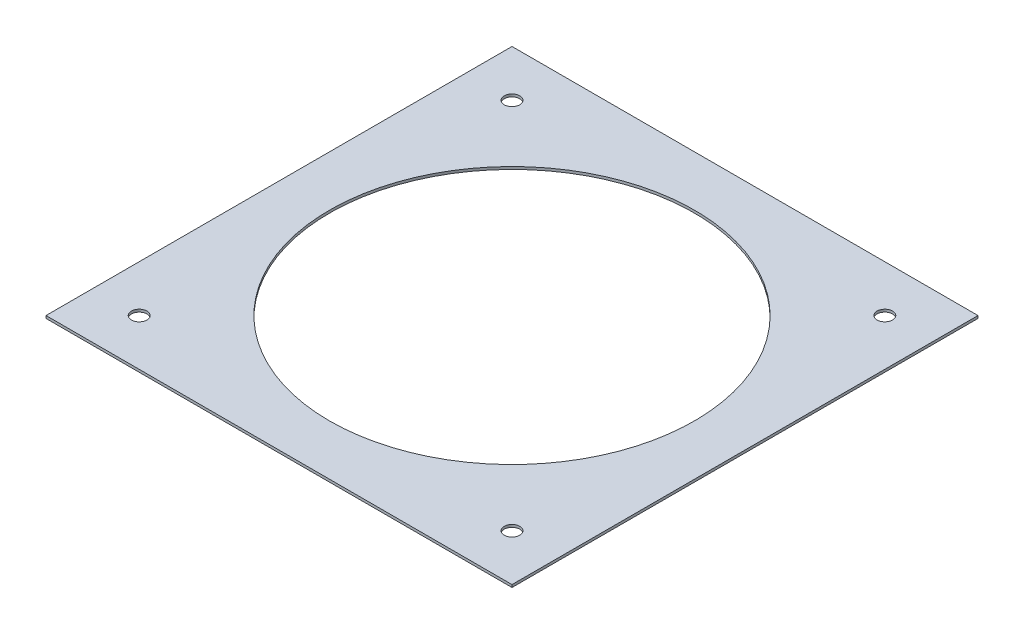
ISO-10303-21;
HEADER;
FILE_DESCRIPTION(('STEP AP214'),'2;1');
FILE_NAME('part.step','',(''),(''),'','','');
FILE_SCHEMA(('AUTOMOTIVE_DESIGN { 1 0 10303 214 1 1 1 1 }'));
ENDSEC;
DATA;
#1=APPLICATION_CONTEXT('core data for automotive mechanical design processes');
#2=APPLICATION_PROTOCOL_DEFINITION('international standard','automotive_design',2000,#1);
#3=PRODUCT_CONTEXT('',#1,'mechanical');
#4=PRODUCT('Part','Part','',(#3));
#5=PRODUCT_RELATED_PRODUCT_CATEGORY('part','',(#4));
#6=PRODUCT_DEFINITION_FORMATION('','',#4);
#7=PRODUCT_DEFINITION_CONTEXT('part definition',#1,'design');
#8=PRODUCT_DEFINITION('design','',#6,#7);
#9=PRODUCT_DEFINITION_SHAPE('','',#8);
#10=(LENGTH_UNIT() NAMED_UNIT(*) SI_UNIT(.MILLI.,.METRE.));
#11=(NAMED_UNIT(*) PLANE_ANGLE_UNIT() SI_UNIT($,.RADIAN.));
#12=(NAMED_UNIT(*) SI_UNIT($,.STERADIAN.) SOLID_ANGLE_UNIT());
#13=UNCERTAINTY_MEASURE_WITH_UNIT(LENGTH_MEASURE(1.E-05),#10,'distance_accuracy_value','');
#14=(GEOMETRIC_REPRESENTATION_CONTEXT(3) GLOBAL_UNCERTAINTY_ASSIGNED_CONTEXT((#13)) GLOBAL_UNIT_ASSIGNED_CONTEXT((#10,
#11,#12)) REPRESENTATION_CONTEXT('',''));
#15=CARTESIAN_POINT('',(0.,0.,0.));
#16=DIRECTION('',(0.,0.,1.));
#17=DIRECTION('',(1.,0.,0.));
#18=AXIS2_PLACEMENT_3D('',#15,#16,#17);
#19=CARTESIAN_POINT('',(0.,0.4191,0.));
#20=DIRECTION('',(0.,-1.,0.));
#21=DIRECTION('',(0.,0.,-1.));
#22=AXIS2_PLACEMENT_3D('',#19,#20,#21);
#23=PLANE('',#22);
#24=CARTESIAN_POINT('',(-60.9599999999998,0.4191,60.9600000000002));
#25=DIRECTION('',(0.,1.,0.));
#26=DIRECTION('',(1.,0.,0.));
#27=AXIS2_PLACEMENT_3D('',#24,#25,#26);
#28=CIRCLE('',#27,2.54);
#29=CARTESIAN_POINT('',(-58.4199999999998,0.4191,60.9600000000002));
#30=VERTEX_POINT('',#29);
#31=EDGE_CURVE('E162',#30,#30,#28,.T.);
#32=ORIENTED_EDGE('',*,*,#31,.F.);
#33=EDGE_LOOP('',(#32));
#34=FACE_BOUND('',#33,.T.);
#35=CARTESIAN_POINT('',(60.96,0.4191,60.96));
#36=DIRECTION('',(0.,1.,0.));
#37=DIRECTION('',(0.,0.,-1.));
#38=AXIS2_PLACEMENT_3D('',#35,#36,#37);
#39=CIRCLE('',#38,2.54);
#40=CARTESIAN_POINT('',(60.96,0.4191,58.42));
#41=VERTEX_POINT('',#40);
#42=EDGE_CURVE('E154',#41,#41,#39,.T.);
#43=ORIENTED_EDGE('',*,*,#42,.F.);
#44=EDGE_LOOP('',(#43));
#45=FACE_BOUND('',#44,.T.);
#46=CARTESIAN_POINT('',(60.9599999999994,0.4191,-60.9600000000006));
#47=DIRECTION('',(0.,1.,0.));
#48=DIRECTION('',(-1.,0.,0.));
#49=AXIS2_PLACEMENT_3D('',#46,#47,#48);
#50=CIRCLE('',#49,2.54);
#51=CARTESIAN_POINT('',(58.4199999999994,0.4191,-60.9600000000006));
#52=VERTEX_POINT('',#51);
#53=EDGE_CURVE('E146',#52,#52,#50,.T.);
#54=ORIENTED_EDGE('',*,*,#53,.F.);
#55=EDGE_LOOP('',(#54));
#56=FACE_BOUND('',#55,.T.);
#57=CARTESIAN_POINT('',(-60.96,0.4191,-60.96));
#58=DIRECTION('',(0.,1.,0.));
#59=DIRECTION('',(0.,0.,1.));
#60=AXIS2_PLACEMENT_3D('',#57,#58,#59);
#61=CIRCLE('',#60,2.54);
#62=CARTESIAN_POINT('',(-60.96,0.4191,-58.42));
#63=VERTEX_POINT('',#62);
#64=EDGE_CURVE('E138',#63,#63,#61,.T.);
#65=ORIENTED_EDGE('',*,*,#64,.F.);
#66=EDGE_LOOP('',(#65));
#67=FACE_BOUND('',#66,.T.);
#68=DIRECTION('',(0.,0.,-1.));
#69=VECTOR('',#68,1.);
#70=CARTESIAN_POINT('',(76.2,0.4191,76.2));
#71=LINE('',#70,#69);
#72=CARTESIAN_POINT('',(76.2,0.4191,76.2));
#73=VERTEX_POINT('',#72);
#74=CARTESIAN_POINT('',(76.2,0.4191,-76.2));
#75=VERTEX_POINT('',#74);
#76=EDGE_CURVE('E92',#73,#75,#71,.T.);
#77=ORIENTED_EDGE('',*,*,#76,.T.);
#78=DIRECTION('',(-1.,0.,0.));
#79=VECTOR('',#78,1.);
#80=CARTESIAN_POINT('',(-76.2,0.4191,-76.2));
#81=LINE('',#80,#79);
#82=CARTESIAN_POINT('',(-76.2,0.4191,-76.2));
#83=VERTEX_POINT('',#82);
#84=EDGE_CURVE('E87',#75,#83,#81,.T.);
#85=ORIENTED_EDGE('',*,*,#84,.T.);
#86=DIRECTION('',(0.,0.,1.));
#87=VECTOR('',#86,1.);
#88=CARTESIAN_POINT('',(-76.2,0.4191,76.2));
#89=LINE('',#88,#87);
#90=CARTESIAN_POINT('',(-76.2,0.4191,76.2));
#91=VERTEX_POINT('',#90);
#92=EDGE_CURVE('E90',#83,#91,#89,.T.);
#93=ORIENTED_EDGE('',*,*,#92,.T.);
#94=DIRECTION('',(1.,0.,0.));
#95=VECTOR('',#94,1.);
#96=CARTESIAN_POINT('',(-76.2,0.4191,76.2));
#97=LINE('',#96,#95);
#98=EDGE_CURVE('E57',#91,#73,#97,.T.);
#99=ORIENTED_EDGE('',*,*,#98,.T.);
#100=EDGE_LOOP('',(#77,#85,#93,#99));
#101=FACE_BOUND('',#100,.T.);
#102=CARTESIAN_POINT('',(0.,0.4191,0.));
#103=DIRECTION('',(0.,1.,0.));
#104=DIRECTION('',(0.,0.,1.));
#105=AXIS2_PLACEMENT_3D('',#102,#103,#104);
#106=CIRCLE('',#105,59.69);
#107=CARTESIAN_POINT('',(0.,0.4191,59.69));
#108=VERTEX_POINT('',#107);
#109=EDGE_CURVE('E112',#108,#108,#106,.T.);
#110=ORIENTED_EDGE('',*,*,#109,.F.);
#111=EDGE_LOOP('',(#110));
#112=FACE_BOUND('',#111,.T.);
#113=ADVANCED_FACE('F39',(#34,#45,#56,#67,#101,#112),#23,.F.);
#114=CARTESIAN_POINT('',(0.,-0.4191,0.));
#115=DIRECTION('',(0.,-1.,0.));
#116=DIRECTION('',(0.,0.,-1.));
#117=AXIS2_PLACEMENT_3D('',#114,#115,#116);
#118=PLANE('',#117);
#119=CARTESIAN_POINT('',(-60.9599999999998,-0.4191,60.9600000000002));
#120=DIRECTION('',(0.,1.,0.));
#121=DIRECTION('',(1.,0.,0.));
#122=AXIS2_PLACEMENT_3D('',#119,#120,#121);
#123=CIRCLE('',#122,2.54);
#124=CARTESIAN_POINT('',(-58.4199999999998,-0.4191,60.9600000000002));
#125=VERTEX_POINT('',#124);
#126=EDGE_CURVE('E142',#125,#125,#123,.T.);
#127=ORIENTED_EDGE('',*,*,#126,.T.);
#128=EDGE_LOOP('',(#127));
#129=FACE_BOUND('',#128,.T.);
#130=CARTESIAN_POINT('',(60.96,-0.4191,60.96));
#131=DIRECTION('',(0.,1.,0.));
#132=DIRECTION('',(0.,0.,-1.));
#133=AXIS2_PLACEMENT_3D('',#130,#131,#132);
#134=CIRCLE('',#133,2.54);
#135=CARTESIAN_POINT('',(60.96,-0.4191,58.42));
#136=VERTEX_POINT('',#135);
#137=EDGE_CURVE('E158',#136,#136,#134,.T.);
#138=ORIENTED_EDGE('',*,*,#137,.T.);
#139=EDGE_LOOP('',(#138));
#140=FACE_BOUND('',#139,.T.);
#141=CARTESIAN_POINT('',(60.9599999999994,-0.4191,-60.9600000000006));
#142=DIRECTION('',(0.,1.,0.));
#143=DIRECTION('',(-1.,0.,0.));
#144=AXIS2_PLACEMENT_3D('',#141,#142,#143);
#145=CIRCLE('',#144,2.54);
#146=CARTESIAN_POINT('',(58.4199999999994,-0.4191,-60.9600000000006));
#147=VERTEX_POINT('',#146);
#148=EDGE_CURVE('E150',#147,#147,#145,.T.);
#149=ORIENTED_EDGE('',*,*,#148,.T.);
#150=EDGE_LOOP('',(#149));
#151=FACE_BOUND('',#150,.T.);
#152=CARTESIAN_POINT('',(-60.96,-0.4191,-60.96));
#153=DIRECTION('',(0.,1.,0.));
#154=DIRECTION('',(0.,0.,1.));
#155=AXIS2_PLACEMENT_3D('',#152,#153,#154);
#156=CIRCLE('',#155,2.54);
#157=CARTESIAN_POINT('',(-60.96,-0.4191,-58.42));
#158=VERTEX_POINT('',#157);
#159=EDGE_CURVE('E134',#158,#158,#156,.T.);
#160=ORIENTED_EDGE('',*,*,#159,.T.);
#161=EDGE_LOOP('',(#160));
#162=FACE_BOUND('',#161,.T.);
#163=DIRECTION('',(0.,0.,-1.));
#164=VECTOR('',#163,1.);
#165=CARTESIAN_POINT('',(76.2,-0.4191,76.2));
#166=LINE('',#165,#164);
#167=CARTESIAN_POINT('',(76.2,-0.4191,76.2));
#168=VERTEX_POINT('',#167);
#169=CARTESIAN_POINT('',(76.2,-0.4191,-76.2));
#170=VERTEX_POINT('',#169);
#171=EDGE_CURVE('E108',#168,#170,#166,.T.);
#172=ORIENTED_EDGE('',*,*,#171,.F.);
#173=DIRECTION('',(1.,0.,0.));
#174=VECTOR('',#173,1.);
#175=CARTESIAN_POINT('',(-76.2,-0.4191,76.2));
#176=LINE('',#175,#174);
#177=CARTESIAN_POINT('',(-76.2,-0.4191,76.2));
#178=VERTEX_POINT('',#177);
#179=EDGE_CURVE('E80',#178,#168,#176,.T.);
#180=ORIENTED_EDGE('',*,*,#179,.F.);
#181=DIRECTION('',(0.,0.,1.));
#182=VECTOR('',#181,1.);
#183=CARTESIAN_POINT('',(-76.2,-0.4191,76.2));
#184=LINE('',#183,#182);
#185=CARTESIAN_POINT('',(-76.2,-0.4191,-76.2));
#186=VERTEX_POINT('',#185);
#187=EDGE_CURVE('E74',#186,#178,#184,.T.);
#188=ORIENTED_EDGE('',*,*,#187,.F.);
#189=DIRECTION('',(-1.,0.,0.));
#190=VECTOR('',#189,1.);
#191=CARTESIAN_POINT('',(-76.2,-0.4191,-76.2));
#192=LINE('',#191,#190);
#193=EDGE_CURVE('E97',#170,#186,#192,.T.);
#194=ORIENTED_EDGE('',*,*,#193,.F.);
#195=EDGE_LOOP('',(#172,#180,#188,#194));
#196=FACE_BOUND('',#195,.T.);
#197=CARTESIAN_POINT('',(0.,-0.4191,0.));
#198=DIRECTION('',(0.,1.,0.));
#199=DIRECTION('',(0.,0.,1.));
#200=AXIS2_PLACEMENT_3D('',#197,#198,#199);
#201=CIRCLE('',#200,59.69);
#202=CARTESIAN_POINT('',(0.,-0.4191,59.69));
#203=VERTEX_POINT('',#202);
#204=EDGE_CURVE('E130',#203,#203,#201,.T.);
#205=ORIENTED_EDGE('',*,*,#204,.T.);
#206=EDGE_LOOP('',(#205));
#207=FACE_BOUND('',#206,.T.);
#208=ADVANCED_FACE('F125',(#129,#140,#151,#162,#196,#207),#118,.T.);
#209=CARTESIAN_POINT('',(76.2,0.4191,76.2));
#210=DIRECTION('',(-1.,0.,0.));
#211=DIRECTION('',(0.,0.,1.));
#212=AXIS2_PLACEMENT_3D('',#209,#210,#211);
#213=PLANE('',#212);
#214=ORIENTED_EDGE('',*,*,#171,.T.);
#215=DIRECTION('',(0.,-1.,0.));
#216=VECTOR('',#215,1.);
#217=CARTESIAN_POINT('',(76.2,0.4191,-76.2));
#218=LINE('',#217,#216);
#219=EDGE_CURVE('E11',#75,#170,#218,.T.);
#220=ORIENTED_EDGE('',*,*,#219,.F.);
#221=ORIENTED_EDGE('',*,*,#76,.F.);
#222=DIRECTION('',(0.,-1.,0.));
#223=VECTOR('',#222,1.);
#224=CARTESIAN_POINT('',(76.2,0.4191,76.2));
#225=LINE('',#224,#223);
#226=EDGE_CURVE('E104',#73,#168,#225,.T.);
#227=ORIENTED_EDGE('',*,*,#226,.T.);
#228=EDGE_LOOP('',(#214,#220,#221,#227));
#229=FACE_BOUND('',#228,.T.);
#230=ADVANCED_FACE('F41',(#229),#213,.F.);
#231=CARTESIAN_POINT('',(-76.2,0.4191,-76.2));
#232=DIRECTION('',(0.,0.,1.));
#233=DIRECTION('',(1.,0.,0.));
#234=AXIS2_PLACEMENT_3D('',#231,#232,#233);
#235=PLANE('',#234);
#236=ORIENTED_EDGE('',*,*,#193,.T.);
#237=DIRECTION('',(0.,-1.,0.));
#238=VECTOR('',#237,1.);
#239=CARTESIAN_POINT('',(-76.2,0.4191,-76.2));
#240=LINE('',#239,#238);
#241=EDGE_CURVE('E49',#83,#186,#240,.T.);
#242=ORIENTED_EDGE('',*,*,#241,.F.);
#243=ORIENTED_EDGE('',*,*,#84,.F.);
#244=ORIENTED_EDGE('',*,*,#219,.T.);
#245=EDGE_LOOP('',(#236,#242,#243,#244));
#246=FACE_BOUND('',#245,.T.);
#247=ADVANCED_FACE('F96',(#246),#235,.F.);
#248=CARTESIAN_POINT('',(-76.2,0.4191,76.2));
#249=DIRECTION('',(1.,0.,0.));
#250=DIRECTION('',(0.,0.,-1.));
#251=AXIS2_PLACEMENT_3D('',#248,#249,#250);
#252=PLANE('',#251);
#253=ORIENTED_EDGE('',*,*,#187,.T.);
#254=DIRECTION('',(0.,-1.,0.));
#255=VECTOR('',#254,1.);
#256=CARTESIAN_POINT('',(-76.2,0.4191,76.2));
#257=LINE('',#256,#255);
#258=EDGE_CURVE('E99',#91,#178,#257,.T.);
#259=ORIENTED_EDGE('',*,*,#258,.F.);
#260=ORIENTED_EDGE('',*,*,#92,.F.);
#261=ORIENTED_EDGE('',*,*,#241,.T.);
#262=EDGE_LOOP('',(#253,#259,#260,#261));
#263=FACE_BOUND('',#262,.T.);
#264=ADVANCED_FACE('F100',(#263),#252,.F.);
#265=CARTESIAN_POINT('',(-76.2,0.4191,76.2));
#266=DIRECTION('',(0.,0.,-1.));
#267=DIRECTION('',(-1.,0.,0.));
#268=AXIS2_PLACEMENT_3D('',#265,#266,#267);
#269=PLANE('',#268);
#270=ORIENTED_EDGE('',*,*,#179,.T.);
#271=ORIENTED_EDGE('',*,*,#226,.F.);
#272=ORIENTED_EDGE('',*,*,#98,.F.);
#273=ORIENTED_EDGE('',*,*,#258,.T.);
#274=EDGE_LOOP('',(#270,#271,#272,#273));
#275=FACE_BOUND('',#274,.T.);
#276=ADVANCED_FACE('F122',(#275),#269,.F.);
#277=CARTESIAN_POINT('',(0.,0.4191,0.));
#278=DIRECTION('',(0.,-1.,0.));
#279=DIRECTION('',(0.,0.,-1.));
#280=AXIS2_PLACEMENT_3D('',#277,#278,#279);
#281=CYLINDRICAL_SURFACE('',#280,59.69);
#282=ORIENTED_EDGE('',*,*,#109,.T.);
#283=EDGE_LOOP('',(#282));
#284=FACE_BOUND('',#283,.T.);
#285=ORIENTED_EDGE('',*,*,#204,.F.);
#286=EDGE_LOOP('',(#285));
#287=FACE_BOUND('',#286,.T.);
#288=ADVANCED_FACE('F191',(#284,#287),#281,.F.);
#289=CARTESIAN_POINT('',(-60.96,-0.4191,-60.96));
#290=DIRECTION('',(0.,1.,0.));
#291=DIRECTION('',(0.,0.,1.));
#292=AXIS2_PLACEMENT_3D('',#289,#290,#291);
#293=CYLINDRICAL_SURFACE('',#292,2.54);
#294=ORIENTED_EDGE('',*,*,#159,.F.);
#295=EDGE_LOOP('',(#294));
#296=FACE_BOUND('',#295,.T.);
#297=ORIENTED_EDGE('',*,*,#64,.T.);
#298=EDGE_LOOP('',(#297));
#299=FACE_BOUND('',#298,.T.);
#300=ADVANCED_FACE('F188',(#296,#299),#293,.F.);
#301=CARTESIAN_POINT('',(60.9599999999994,-0.4191,-60.9600000000006));
#302=DIRECTION('',(0.,1.,0.));
#303=DIRECTION('',(0.,0.,1.));
#304=AXIS2_PLACEMENT_3D('',#301,#302,#303);
#305=CYLINDRICAL_SURFACE('',#304,2.54);
#306=ORIENTED_EDGE('',*,*,#148,.F.);
#307=EDGE_LOOP('',(#306));
#308=FACE_BOUND('',#307,.T.);
#309=ORIENTED_EDGE('',*,*,#53,.T.);
#310=EDGE_LOOP('',(#309));
#311=FACE_BOUND('',#310,.T.);
#312=ADVANCED_FACE('F190',(#308,#311),#305,.F.);
#313=CARTESIAN_POINT('',(60.96,-0.4191,60.96));
#314=DIRECTION('',(0.,1.,0.));
#315=DIRECTION('',(0.,0.,1.));
#316=AXIS2_PLACEMENT_3D('',#313,#314,#315);
#317=CYLINDRICAL_SURFACE('',#316,2.54);
#318=ORIENTED_EDGE('',*,*,#137,.F.);
#319=EDGE_LOOP('',(#318));
#320=FACE_BOUND('',#319,.T.);
#321=ORIENTED_EDGE('',*,*,#42,.T.);
#322=EDGE_LOOP('',(#321));
#323=FACE_BOUND('',#322,.T.);
#324=ADVANCED_FACE('F175',(#320,#323),#317,.F.);
#325=CARTESIAN_POINT('',(-60.9599999999998,-0.4191,60.9600000000002));
#326=DIRECTION('',(0.,1.,0.));
#327=DIRECTION('',(0.,0.,1.));
#328=AXIS2_PLACEMENT_3D('',#325,#326,#327);
#329=CYLINDRICAL_SURFACE('',#328,2.54);
#330=ORIENTED_EDGE('',*,*,#126,.F.);
#331=EDGE_LOOP('',(#330));
#332=FACE_BOUND('',#331,.T.);
#333=ORIENTED_EDGE('',*,*,#31,.T.);
#334=EDGE_LOOP('',(#333));
#335=FACE_BOUND('',#334,.T.);
#336=ADVANCED_FACE('F172',(#332,#335),#329,.F.);
#337=CLOSED_SHELL('',(#113,#208,#230,#247,#264,#276,#288,#300,#312,#324,#336));
#338=MANIFOLD_SOLID_BREP('B2',#337);
#339=ADVANCED_BREP_SHAPE_REPRESENTATION('',(#18,#338),#14);
#340=SHAPE_DEFINITION_REPRESENTATION(#9,#339);
ENDSEC;
END-ISO-10303-21;
